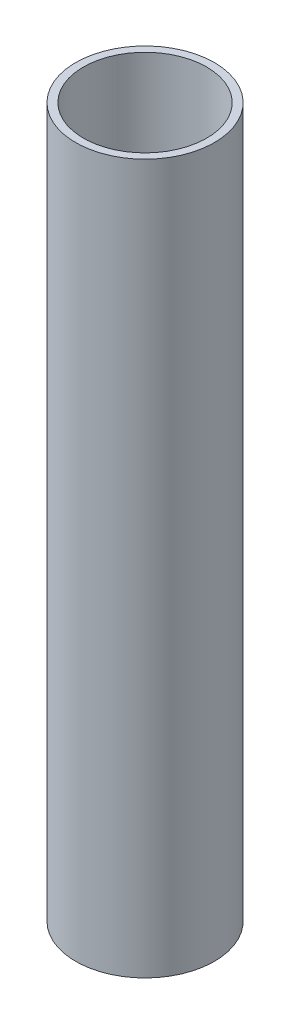
ISO-10303-21;
HEADER;
FILE_DESCRIPTION(('STEP AP214'),'2;1');
FILE_NAME('part.step','',(''),(''),'','','');
FILE_SCHEMA(('AUTOMOTIVE_DESIGN { 1 0 10303 214 1 1 1 1 }'));
ENDSEC;
DATA;
#1=APPLICATION_CONTEXT('core data for automotive mechanical design processes');
#2=APPLICATION_PROTOCOL_DEFINITION('international standard','automotive_design',2000,#1);
#3=PRODUCT_CONTEXT('',#1,'mechanical');
#4=PRODUCT('Part','Part','',(#3));
#5=PRODUCT_RELATED_PRODUCT_CATEGORY('part','',(#4));
#6=PRODUCT_DEFINITION_FORMATION('','',#4);
#7=PRODUCT_DEFINITION_CONTEXT('part definition',#1,'design');
#8=PRODUCT_DEFINITION('design','',#6,#7);
#9=PRODUCT_DEFINITION_SHAPE('','',#8);
#10=(LENGTH_UNIT() NAMED_UNIT(*) SI_UNIT(.MILLI.,.METRE.));
#11=(NAMED_UNIT(*) PLANE_ANGLE_UNIT() SI_UNIT($,.RADIAN.));
#12=(NAMED_UNIT(*) SI_UNIT($,.STERADIAN.) SOLID_ANGLE_UNIT());
#13=UNCERTAINTY_MEASURE_WITH_UNIT(LENGTH_MEASURE(1.E-05),#10,'distance_accuracy_value','');
#14=(GEOMETRIC_REPRESENTATION_CONTEXT(3) GLOBAL_UNCERTAINTY_ASSIGNED_CONTEXT((#13)) GLOBAL_UNIT_ASSIGNED_CONTEXT((#10,
#11,#12)) REPRESENTATION_CONTEXT('',''));
#15=CARTESIAN_POINT('',(0.,0.,0.));
#16=DIRECTION('',(0.,0.,1.));
#17=DIRECTION('',(1.,0.,0.));
#18=AXIS2_PLACEMENT_3D('',#15,#16,#17);
#19=CARTESIAN_POINT('',(0.,233.68,0.));
#20=DIRECTION('',(0.,1.,0.));
#21=DIRECTION('',(0.,0.,1.));
#22=AXIS2_PLACEMENT_3D('',#19,#20,#21);
#23=PLANE('',#22);
#24=CARTESIAN_POINT('',(0.,233.68,0.));
#25=DIRECTION('',(0.,1.,0.));
#26=DIRECTION('',(0.,0.,1.));
#27=AXIS2_PLACEMENT_3D('',#24,#25,#26);
#28=CIRCLE('',#27,22.86);
#29=CARTESIAN_POINT('',(0.,233.68,-22.86));
#30=VERTEX_POINT('',#29);
#31=EDGE_CURVE('E10',#30,#30,#28,.T.);
#32=ORIENTED_EDGE('',*,*,#31,.T.);
#33=EDGE_LOOP('',(#32));
#34=FACE_BOUND('',#33,.T.);
#35=CARTESIAN_POINT('',(0.,233.68,0.));
#36=DIRECTION('',(0.,1.,0.));
#37=DIRECTION('',(0.,0.,1.));
#38=AXIS2_PLACEMENT_3D('',#35,#36,#37);
#39=CIRCLE('',#38,20.32);
#40=CARTESIAN_POINT('',(0.,233.68,-20.32));
#41=VERTEX_POINT('',#40);
#42=EDGE_CURVE('E42',#41,#41,#39,.T.);
#43=ORIENTED_EDGE('',*,*,#42,.F.);
#44=EDGE_LOOP('',(#43));
#45=FACE_BOUND('',#44,.T.);
#46=ADVANCED_FACE('F31',(#34,#45),#23,.T.);
#47=CARTESIAN_POINT('',(0.,0.,0.));
#48=DIRECTION('',(0.,1.,0.));
#49=DIRECTION('',(0.,0.,1.));
#50=AXIS2_PLACEMENT_3D('',#47,#48,#49);
#51=PLANE('',#50);
#52=CARTESIAN_POINT('',(0.,0.,0.));
#53=DIRECTION('',(0.,1.,0.));
#54=DIRECTION('',(0.,0.,1.));
#55=AXIS2_PLACEMENT_3D('',#52,#53,#54);
#56=CIRCLE('',#55,22.86);
#57=CARTESIAN_POINT('',(0.,0.,-22.86));
#58=VERTEX_POINT('',#57);
#59=EDGE_CURVE('E35',#58,#58,#56,.T.);
#60=ORIENTED_EDGE('',*,*,#59,.F.);
#61=EDGE_LOOP('',(#60));
#62=FACE_BOUND('',#61,.T.);
#63=CARTESIAN_POINT('',(0.,0.,0.));
#64=DIRECTION('',(0.,1.,0.));
#65=DIRECTION('',(0.,0.,1.));
#66=AXIS2_PLACEMENT_3D('',#63,#64,#65);
#67=CIRCLE('',#66,20.32);
#68=CARTESIAN_POINT('',(0.,0.,-20.32));
#69=VERTEX_POINT('',#68);
#70=EDGE_CURVE('E44',#69,#69,#67,.T.);
#71=ORIENTED_EDGE('',*,*,#70,.T.);
#72=EDGE_LOOP('',(#71));
#73=FACE_BOUND('',#72,.T.);
#74=ADVANCED_FACE('F54',(#62,#73),#51,.F.);
#75=CARTESIAN_POINT('',(0.,233.68,0.));
#76=DIRECTION('',(0.,-1.,0.));
#77=DIRECTION('',(0.,0.,-1.));
#78=AXIS2_PLACEMENT_3D('',#75,#76,#77);
#79=CYLINDRICAL_SURFACE('',#78,22.86);
#80=CARTESIAN_POINT('',(0.,233.68,-22.86));
#81=CARTESIAN_POINT('',(0.,231.245833333333,-22.86));
#82=CARTESIAN_POINT('',(0.,228.811666666667,-22.86));
#83=CARTESIAN_POINT('',(0.,223.943333333333,-22.86));
#84=CARTESIAN_POINT('',(0.,221.509166666667,-22.86));
#85=CARTESIAN_POINT('',(0.,216.640833333333,-22.86));
#86=CARTESIAN_POINT('',(0.,214.206666666667,-22.86));
#87=CARTESIAN_POINT('',(0.,209.338333333333,-22.86));
#88=CARTESIAN_POINT('',(0.,206.904166666667,-22.86));
#89=CARTESIAN_POINT('',(0.,202.035833333333,-22.86));
#90=CARTESIAN_POINT('',(0.,199.601666666667,-22.86));
#91=CARTESIAN_POINT('',(0.,194.733333333333,-22.86));
#92=CARTESIAN_POINT('',(0.,192.299166666667,-22.86));
#93=CARTESIAN_POINT('',(0.,187.430833333333,-22.86));
#94=CARTESIAN_POINT('',(0.,184.996666666667,-22.86));
#95=CARTESIAN_POINT('',(0.,180.128333333333,-22.86));
#96=CARTESIAN_POINT('',(0.,177.694166666667,-22.86));
#97=CARTESIAN_POINT('',(0.,172.825833333333,-22.86));
#98=CARTESIAN_POINT('',(0.,170.391666666667,-22.86));
#99=CARTESIAN_POINT('',(0.,165.523333333333,-22.86));
#100=CARTESIAN_POINT('',(0.,163.089166666667,-22.86));
#101=CARTESIAN_POINT('',(0.,158.220833333333,-22.86));
#102=CARTESIAN_POINT('',(0.,155.786666666667,-22.86));
#103=CARTESIAN_POINT('',(0.,150.918333333333,-22.86));
#104=CARTESIAN_POINT('',(0.,148.484166666667,-22.86));
#105=CARTESIAN_POINT('',(0.,143.615833333333,-22.86));
#106=CARTESIAN_POINT('',(0.,141.181666666667,-22.86));
#107=CARTESIAN_POINT('',(0.,136.313333333333,-22.86));
#108=CARTESIAN_POINT('',(0.,133.879166666667,-22.86));
#109=CARTESIAN_POINT('',(0.,129.010833333333,-22.86));
#110=CARTESIAN_POINT('',(0.,126.576666666667,-22.86));
#111=CARTESIAN_POINT('',(0.,121.708333333333,-22.86));
#112=CARTESIAN_POINT('',(0.,119.274166666667,-22.86));
#113=CARTESIAN_POINT('',(0.,114.405833333333,-22.86));
#114=CARTESIAN_POINT('',(0.,111.971666666667,-22.86));
#115=CARTESIAN_POINT('',(0.,107.103333333333,-22.86));
#116=CARTESIAN_POINT('',(0.,104.669166666667,-22.86));
#117=CARTESIAN_POINT('',(0.,99.8008333333333,-22.86));
#118=CARTESIAN_POINT('',(0.,97.3666666666667,-22.86));
#119=CARTESIAN_POINT('',(0.,92.4983333333333,-22.86));
#120=CARTESIAN_POINT('',(0.,90.0641666666667,-22.86));
#121=CARTESIAN_POINT('',(0.,85.1958333333333,-22.86));
#122=CARTESIAN_POINT('',(0.,82.7616666666667,-22.86));
#123=CARTESIAN_POINT('',(0.,77.8933333333333,-22.86));
#124=CARTESIAN_POINT('',(0.,75.4591666666667,-22.86));
#125=CARTESIAN_POINT('',(0.,70.5908333333333,-22.86));
#126=CARTESIAN_POINT('',(0.,68.1566666666667,-22.86));
#127=CARTESIAN_POINT('',(0.,63.2883333333333,-22.86));
#128=CARTESIAN_POINT('',(0.,60.8541666666667,-22.86));
#129=CARTESIAN_POINT('',(0.,55.9858333333333,-22.86));
#130=CARTESIAN_POINT('',(0.,53.5516666666667,-22.86));
#131=CARTESIAN_POINT('',(0.,48.6833333333333,-22.86));
#132=CARTESIAN_POINT('',(0.,46.2491666666667,-22.86));
#133=CARTESIAN_POINT('',(0.,41.3808333333333,-22.86));
#134=CARTESIAN_POINT('',(0.,38.9466666666667,-22.86));
#135=CARTESIAN_POINT('',(0.,34.0783333333333,-22.86));
#136=CARTESIAN_POINT('',(0.,31.6441666666667,-22.86));
#137=CARTESIAN_POINT('',(0.,26.7758333333333,-22.86));
#138=CARTESIAN_POINT('',(0.,24.3416666666667,-22.86));
#139=CARTESIAN_POINT('',(0.,19.4733333333333,-22.86));
#140=CARTESIAN_POINT('',(0.,17.0391666666667,-22.86));
#141=CARTESIAN_POINT('',(0.,12.1708333333333,-22.86));
#142=CARTESIAN_POINT('',(0.,9.73666666666666,-22.86));
#143=CARTESIAN_POINT('',(0.,4.86833333333333,-22.86));
#144=CARTESIAN_POINT('',(0.,2.43416666666666,-22.86));
#145=CARTESIAN_POINT('',(0.,0.,-22.86));
#146=B_SPLINE_CURVE_WITH_KNOTS('',3,(#80,#81,#82,#83,#84,#85,#86,#87,#88,#89,#90,#91,#92,#93,
#94,#95,#96,#97,#98,#99,#100,#101,#102,#103,#104,#105,#106,#107,#108,#109,#110,#111,#112,#113,
#114,#115,#116,#117,#118,#119,#120,#121,#122,#123,#124,#125,#126,#127,#128,#129,#130,#131,#132,
#133,#134,#135,#136,#137,#138,#139,#140,#141,#142,#143,#144,#145),.UNSPECIFIED.,.F.,.F.,(4,2,2,
2,2,2,2,2,2,2,2,2,2,2,2,2,2,2,2,2,2,2,2,2,2,2,2,2,2,2,2,2,4),(0.,7.30250000000002,14.605,
21.9075,29.21,36.5125,43.815,51.1175,58.42,65.7225,73.025,80.3275,87.63,94.9325,102.235,
109.5375,116.84,124.1425,131.445,138.7475,146.05,153.3525,160.655,167.9575,175.26,182.5625,
189.865,197.1675,204.47,211.7725,219.075,226.3775,233.68),.UNSPECIFIED.);
#147=EDGE_CURVE('BSEAM33',#30,#58,#146,.T.);
#148=ORIENTED_EDGE('',*,*,#31,.F.);
#149=ORIENTED_EDGE('',*,*,#59,.T.);
#150=ORIENTED_EDGE('',*,*,#147,.T.);
#151=ORIENTED_EDGE('',*,*,#147,.F.);
#152=EDGE_LOOP('',(#148,#150,#149,#151));
#153=FACE_BOUND('',#152,.T.);
#154=ADVANCED_FACE('F33',(#153),#79,.T.);
#155=CARTESIAN_POINT('',(0.,233.68,0.));
#156=DIRECTION('',(0.,-1.,0.));
#157=DIRECTION('',(0.,0.,-1.));
#158=AXIS2_PLACEMENT_3D('',#155,#156,#157);
#159=CYLINDRICAL_SURFACE('',#158,20.32);
#160=CARTESIAN_POINT('',(0.,233.68,-20.32));
#161=CARTESIAN_POINT('',(0.,231.245833333333,-20.32));
#162=CARTESIAN_POINT('',(0.,228.811666666667,-20.32));
#163=CARTESIAN_POINT('',(0.,223.943333333333,-20.32));
#164=CARTESIAN_POINT('',(0.,221.509166666667,-20.32));
#165=CARTESIAN_POINT('',(0.,216.640833333333,-20.32));
#166=CARTESIAN_POINT('',(0.,214.206666666667,-20.32));
#167=CARTESIAN_POINT('',(0.,209.338333333333,-20.32));
#168=CARTESIAN_POINT('',(0.,206.904166666667,-20.32));
#169=CARTESIAN_POINT('',(0.,202.035833333333,-20.32));
#170=CARTESIAN_POINT('',(0.,199.601666666667,-20.32));
#171=CARTESIAN_POINT('',(0.,194.733333333333,-20.32));
#172=CARTESIAN_POINT('',(0.,192.299166666667,-20.32));
#173=CARTESIAN_POINT('',(0.,187.430833333333,-20.32));
#174=CARTESIAN_POINT('',(0.,184.996666666667,-20.32));
#175=CARTESIAN_POINT('',(0.,180.128333333333,-20.32));
#176=CARTESIAN_POINT('',(0.,177.694166666667,-20.32));
#177=CARTESIAN_POINT('',(0.,172.825833333333,-20.32));
#178=CARTESIAN_POINT('',(0.,170.391666666667,-20.32));
#179=CARTESIAN_POINT('',(0.,165.523333333333,-20.32));
#180=CARTESIAN_POINT('',(0.,163.089166666667,-20.32));
#181=CARTESIAN_POINT('',(0.,158.220833333333,-20.32));
#182=CARTESIAN_POINT('',(0.,155.786666666667,-20.32));
#183=CARTESIAN_POINT('',(0.,150.918333333333,-20.32));
#184=CARTESIAN_POINT('',(0.,148.484166666667,-20.32));
#185=CARTESIAN_POINT('',(0.,143.615833333333,-20.32));
#186=CARTESIAN_POINT('',(0.,141.181666666667,-20.32));
#187=CARTESIAN_POINT('',(0.,136.313333333333,-20.32));
#188=CARTESIAN_POINT('',(0.,133.879166666667,-20.32));
#189=CARTESIAN_POINT('',(0.,129.010833333333,-20.32));
#190=CARTESIAN_POINT('',(0.,126.576666666667,-20.32));
#191=CARTESIAN_POINT('',(0.,121.708333333333,-20.32));
#192=CARTESIAN_POINT('',(0.,119.274166666667,-20.32));
#193=CARTESIAN_POINT('',(0.,114.405833333333,-20.32));
#194=CARTESIAN_POINT('',(0.,111.971666666667,-20.32));
#195=CARTESIAN_POINT('',(0.,107.103333333333,-20.32));
#196=CARTESIAN_POINT('',(0.,104.669166666667,-20.32));
#197=CARTESIAN_POINT('',(0.,99.8008333333333,-20.32));
#198=CARTESIAN_POINT('',(0.,97.3666666666666,-20.32));
#199=CARTESIAN_POINT('',(0.,92.4983333333333,-20.32));
#200=CARTESIAN_POINT('',(0.,90.0641666666667,-20.32));
#201=CARTESIAN_POINT('',(0.,85.1958333333333,-20.32));
#202=CARTESIAN_POINT('',(0.,82.7616666666667,-20.32));
#203=CARTESIAN_POINT('',(0.,77.8933333333333,-20.32));
#204=CARTESIAN_POINT('',(0.,75.4591666666666,-20.32));
#205=CARTESIAN_POINT('',(0.,70.5908333333333,-20.32));
#206=CARTESIAN_POINT('',(0.,68.1566666666667,-20.32));
#207=CARTESIAN_POINT('',(0.,63.2883333333333,-20.32));
#208=CARTESIAN_POINT('',(0.,60.8541666666667,-20.32));
#209=CARTESIAN_POINT('',(0.,55.9858333333333,-20.32));
#210=CARTESIAN_POINT('',(0.,53.5516666666667,-20.32));
#211=CARTESIAN_POINT('',(0.,48.6833333333333,-20.32));
#212=CARTESIAN_POINT('',(0.,46.2491666666667,-20.32));
#213=CARTESIAN_POINT('',(0.,41.3808333333333,-20.32));
#214=CARTESIAN_POINT('',(0.,38.9466666666667,-20.32));
#215=CARTESIAN_POINT('',(0.,34.0783333333333,-20.32));
#216=CARTESIAN_POINT('',(0.,31.6441666666667,-20.32));
#217=CARTESIAN_POINT('',(0.,26.7758333333333,-20.32));
#218=CARTESIAN_POINT('',(0.,24.3416666666667,-20.32));
#219=CARTESIAN_POINT('',(0.,19.4733333333333,-20.32));
#220=CARTESIAN_POINT('',(0.,17.0391666666667,-20.32));
#221=CARTESIAN_POINT('',(0.,12.1708333333333,-20.32));
#222=CARTESIAN_POINT('',(0.,9.73666666666666,-20.32));
#223=CARTESIAN_POINT('',(0.,4.86833333333333,-20.32));
#224=CARTESIAN_POINT('',(0.,2.43416666666666,-20.32));
#225=CARTESIAN_POINT('',(0.,0.,-20.32));
#226=B_SPLINE_CURVE_WITH_KNOTS('',3,(#160,#161,#162,#163,#164,#165,#166,#167,#168,#169,#170,
#171,#172,#173,#174,#175,#176,#177,#178,#179,#180,#181,#182,#183,#184,#185,#186,#187,#188,#189,
#190,#191,#192,#193,#194,#195,#196,#197,#198,#199,#200,#201,#202,#203,#204,#205,#206,#207,#208,
#209,#210,#211,#212,#213,#214,#215,#216,#217,#218,#219,#220,#221,#222,#223,#224,#225),
.UNSPECIFIED.,.F.,.F.,(4,2,2,2,2,2,2,2,2,2,2,2,2,2,2,2,2,2,2,2,2,2,2,2,2,2,2,2,2,2,2,2,4),(0.,
7.30249999999999,14.605,21.9075,29.21,36.5125,43.815,51.1175,58.42,65.7225,73.0249999999999,
80.3275,87.63,94.9325,102.235,109.5375,116.84,124.1425,131.445,138.7475,146.05,153.3525,160.655,
167.9575,175.26,182.5625,189.865,197.1675,204.47,211.7725,219.075,226.3775,233.68),.UNSPECIFIED.);
#227=EDGE_CURVE('BSEAM50',#41,#69,#226,.T.);
#228=ORIENTED_EDGE('',*,*,#42,.T.);
#229=ORIENTED_EDGE('',*,*,#70,.F.);
#230=ORIENTED_EDGE('',*,*,#227,.T.);
#231=ORIENTED_EDGE('',*,*,#227,.F.);
#232=EDGE_LOOP('',(#228,#230,#229,#231));
#233=FACE_BOUND('',#232,.T.);
#234=ADVANCED_FACE('F50',(#233),#159,.F.);
#235=CLOSED_SHELL('',(#46,#74,#154,#234));
#236=MANIFOLD_SOLID_BREP('B2',#235);
#237=ADVANCED_BREP_SHAPE_REPRESENTATION('',(#18,#236),#14);
#238=SHAPE_DEFINITION_REPRESENTATION(#9,#237);
ENDSEC;
END-ISO-10303-21;
